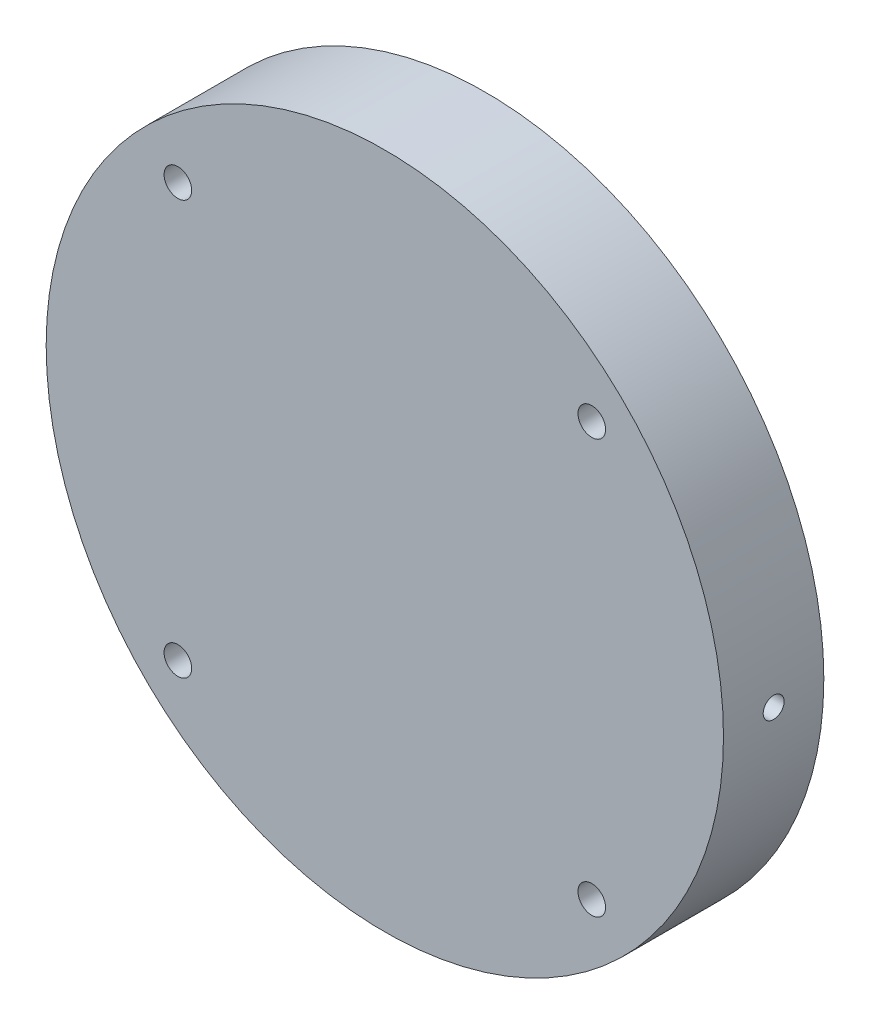
ISO-10303-21;
HEADER;
FILE_DESCRIPTION(('STEP AP214'),'2;1');
FILE_NAME('part.step','',(''),(''),'','','');
FILE_SCHEMA(('AUTOMOTIVE_DESIGN { 1 0 10303 214 1 1 1 1 }'));
ENDSEC;
DATA;
#1=APPLICATION_CONTEXT('core data for automotive mechanical design processes');
#2=APPLICATION_PROTOCOL_DEFINITION('international standard','automotive_design',2000,#1);
#3=PRODUCT_CONTEXT('',#1,'mechanical');
#4=PRODUCT('Part','Part','',(#3));
#5=PRODUCT_RELATED_PRODUCT_CATEGORY('part','',(#4));
#6=PRODUCT_DEFINITION_FORMATION('','',#4);
#7=PRODUCT_DEFINITION_CONTEXT('part definition',#1,'design');
#8=PRODUCT_DEFINITION('design','',#6,#7);
#9=PRODUCT_DEFINITION_SHAPE('','',#8);
#10=(LENGTH_UNIT() NAMED_UNIT(*) SI_UNIT(.MILLI.,.METRE.));
#11=(NAMED_UNIT(*) PLANE_ANGLE_UNIT() SI_UNIT($,.RADIAN.));
#12=(NAMED_UNIT(*) SI_UNIT($,.STERADIAN.) SOLID_ANGLE_UNIT());
#13=UNCERTAINTY_MEASURE_WITH_UNIT(LENGTH_MEASURE(1.E-05),#10,'distance_accuracy_value','');
#14=(GEOMETRIC_REPRESENTATION_CONTEXT(3) GLOBAL_UNCERTAINTY_ASSIGNED_CONTEXT((#13)) GLOBAL_UNIT_ASSIGNED_CONTEXT((#10,
#11,#12)) REPRESENTATION_CONTEXT('',''));
#15=CARTESIAN_POINT('',(0.,0.,0.));
#16=DIRECTION('',(0.,0.,1.));
#17=DIRECTION('',(1.,0.,0.));
#18=AXIS2_PLACEMENT_3D('',#15,#16,#17);
#19=CARTESIAN_POINT('',(0.,0.,12.));
#20=DIRECTION('',(0.,0.,-1.));
#21=DIRECTION('',(-1.,0.,0.));
#22=AXIS2_PLACEMENT_3D('',#19,#20,#21);
#23=CYLINDRICAL_SURFACE('',#22,40.5);
#24=CARTESIAN_POINT('',(40.5,0.,4.75000000000001));
#25=CARTESIAN_POINT('',(40.4999997401698,0.0701951145360593,4.75000310736786));
#26=CARTESIAN_POINT('',(40.4998155477707,0.140440701523904,4.75593267234555));
#27=CARTESIAN_POINT('',(40.4990984748831,0.278996045488437,4.77950391095175));
#28=CARTESIAN_POINT('',(40.4985651780819,0.347303389479052,4.79715956850567));
#29=CARTESIAN_POINT('',(40.4972102897064,0.479954957168128,4.84367879412185));
#30=CARTESIAN_POINT('',(40.4963888393763,0.544301104393843,4.8725368718341));
#31=CARTESIAN_POINT('',(40.4945502970725,0.667217691779053,4.94063386953378));
#32=CARTESIAN_POINT('',(40.493533252822,0.725789535559207,4.9798702581728));
#33=CARTESIAN_POINT('',(40.4914174976183,0.83554065170522,5.06763184249043));
#34=CARTESIAN_POINT('',(40.490318754005,0.886716943316761,5.11616076527566));
#35=CARTESIAN_POINT('',(40.4881637230936,0.980199153577301,5.22112329771871));
#36=CARTESIAN_POINT('',(40.4871074374891,1.02250471865505,5.27755722230622));
#37=CARTESIAN_POINT('',(40.4851562705646,1.09704947867062,5.39673918912488));
#38=CARTESIAN_POINT('',(40.484261418526,1.12928684818432,5.45948837362671));
#39=CARTESIAN_POINT('',(40.4827343342813,1.18276824859674,5.58951150573776));
#40=CARTESIAN_POINT('',(40.4821021009909,1.20401232488276,5.65678543466466));
#41=CARTESIAN_POINT('',(40.4811717855033,1.2348975912265,5.79392555068592));
#42=CARTESIAN_POINT('',(40.4808735961369,1.24454250263951,5.86379089895678));
#43=CARTESIAN_POINT('',(40.4806446684864,1.25196711980756,6.00414962569478));
#44=CARTESIAN_POINT('',(40.4807139286884,1.24974687444769,6.07464300157323));
#45=CARTESIAN_POINT('',(40.4812119900459,1.23350734740564,6.21423148709976));
#46=CARTESIAN_POINT('',(40.4816406686072,1.21949208889029,6.28332706529521));
#47=CARTESIAN_POINT('',(40.482809049167,1.18006660072871,6.41818422832304));
#48=CARTESIAN_POINT('',(40.4835487518711,1.15465634523706,6.48394580559307));
#49=CARTESIAN_POINT('',(40.4852559366052,1.09315755225947,6.6102811737729));
#50=CARTESIAN_POINT('',(40.4862234579563,1.05706717112922,6.67085406666226));
#51=CARTESIAN_POINT('',(40.488277170762,0.975233971561921,6.78508276761878));
#52=CARTESIAN_POINT('',(40.4893633625063,0.929491129555396,6.83873855879517));
#53=CARTESIAN_POINT('',(40.4915325163177,0.829628723808076,6.93763340178835));
#54=CARTESIAN_POINT('',(40.4926154768474,0.775505671470444,6.98286893098563));
#55=CARTESIAN_POINT('',(40.4946556490227,0.660431509347828,7.06361205176098));
#56=CARTESIAN_POINT('',(40.4956128606477,0.599480398440985,7.09911964174074));
#57=CARTESIAN_POINT('',(40.4972936463458,0.472478345778552,7.15939855625796));
#58=CARTESIAN_POINT('',(40.4980172180003,0.40642735123957,7.18416976965723));
#59=CARTESIAN_POINT('',(40.4991491202929,0.271101369502214,7.22227051270385));
#60=CARTESIAN_POINT('',(40.4995574518385,0.201826391585083,7.23560007528741));
#61=CARTESIAN_POINT('',(40.5000127291394,0.0620495237213444,7.25043482031509));
#62=CARTESIAN_POINT('',(40.5000598238567,-0.00845184847957339,7.25194487673143));
#63=CARTESIAN_POINT('',(40.4997877134372,-0.148707100280595,7.24311044626734));
#64=CARTESIAN_POINT('',(40.4994685087506,-0.218460980799522,7.23276597396028));
#65=CARTESIAN_POINT('',(40.4984998696098,-0.355227590857616,7.20052016271211));
#66=CARTESIAN_POINT('',(40.4978504984022,-0.422240842735486,7.17862103714688));
#67=CARTESIAN_POINT('',(40.4962946984923,-0.551639963897454,7.12388980418959));
#68=CARTESIAN_POINT('',(40.4953882692419,-0.614025823314325,7.09105767348535));
#69=CARTESIAN_POINT('',(40.4934200880193,-0.732421678357428,7.01537987027723));
#70=CARTESIAN_POINT('',(40.4923582852174,-0.788429576761468,6.97253091806732));
#71=CARTESIAN_POINT('',(40.490199188575,-0.892458583494792,6.87804061330085));
#72=CARTESIAN_POINT('',(40.4891018946392,-0.940479670406009,6.82639923716659));
#73=CARTESIAN_POINT('',(40.4869950921447,-1.02718818548384,6.71576910949375));
#74=CARTESIAN_POINT('',(40.4859856132424,-1.06587246824192,6.65677789203946));
#75=CARTESIAN_POINT('',(40.4841687227857,-1.13278776142885,6.53313521170553));
#76=CARTESIAN_POINT('',(40.4833613107621,-1.16101879613159,6.46848376197017));
#77=CARTESIAN_POINT('',(40.48203980061,-1.20622070871487,6.33536767135526));
#78=CARTESIAN_POINT('',(40.4815256494901,-1.22319362099849,6.26690372183996));
#79=CARTESIAN_POINT('',(40.4808484820102,-1.24540415885495,6.12809627980892));
#80=CARTESIAN_POINT('',(40.4806854652861,-1.25064179660019,6.05775278924281));
#81=CARTESIAN_POINT('',(40.4807289655028,-1.2492328734932,5.91721453872061));
#82=CARTESIAN_POINT('',(40.4809353282036,-1.24259127299825,5.8470197289337));
#83=CARTESIAN_POINT('',(40.4816939995849,-1.2176226074607,5.7087419764574));
#84=CARTESIAN_POINT('',(40.4822463089505,-1.19929551927702,5.64065903795048));
#85=CARTESIAN_POINT('',(40.4836345878623,-1.15147682252858,5.50853581572959));
#86=CARTESIAN_POINT('',(40.484470562093,-1.12198502958678,5.44449559879863));
#87=CARTESIAN_POINT('',(40.4863318953487,-1.05267572710109,5.32227668770632));
#88=CARTESIAN_POINT('',(40.4873572475588,-1.01285858909954,5.26409778273886));
#89=CARTESIAN_POINT('',(40.4894821855105,-0.924014000321128,5.15523002702427));
#90=CARTESIAN_POINT('',(40.490581794235,-0.874983689545041,5.10454351085483));
#91=CARTESIAN_POINT('',(40.4927313283944,-0.76909528644695,5.01210725955242));
#92=CARTESIAN_POINT('',(40.4937812414624,-0.712235259286227,4.97035973991303));
#93=CARTESIAN_POINT('',(40.4957134097366,-0.592278497600401,4.89697904387425));
#94=CARTESIAN_POINT('',(40.4965955541152,-0.529177681961755,4.86535254405303));
#95=CARTESIAN_POINT('',(40.4980907783657,-0.398607824584967,4.81317937009116));
#96=CARTESIAN_POINT('',(40.4987041788262,-0.331144098338576,4.79261948768989));
#97=CARTESIAN_POINT('',(40.499428913532,-0.219378703445797,4.76860989217457));
#98=CARTESIAN_POINT('',(40.4996421413444,-0.175802433429456,4.76163996794289));
#99=CARTESIAN_POINT('',(40.4999277661545,-0.0881574125274635,4.75233404672987));
#100=CARTESIAN_POINT('',(40.5000001631961,-0.0440886617955865,4.74999804830165));
#101=CARTESIAN_POINT('',(40.5,0.,4.75000000000001));
#102=B_SPLINE_CURVE_WITH_KNOTS('',3,(#24,#25,#26,#27,#28,#29,#30,#31,#32,#33,#34,#35,#36,#37,
#38,#39,#40,#41,#42,#43,#44,#45,#46,#47,#48,#49,#50,#51,#52,#53,#54,#55,#56,#57,#58,#59,#60,#61,
#62,#63,#64,#65,#66,#67,#68,#69,#70,#71,#72,#73,#74,#75,#76,#77,#78,#79,#80,#81,#82,#83,#84,#85,
#86,#87,#88,#89,#90,#91,#92,#93,#94,#95,#96,#97,#98,#99,#100,#101),.UNSPECIFIED.,.T.,.F.,(4,2,2,
2,2,2,2,2,2,2,2,2,2,2,2,2,2,2,2,2,2,2,2,2,2,2,2,2,2,2,2,2,2,2,2,2,2,2,4),(0.,0.210424413908755,
0.421100220650849,0.631672904450732,0.842194275267314,1.05280026082357,1.26341463916158,
1.47406718100888,1.6847188531417,1.89530292394022,2.10588612712154,2.31639753147251,
2.52690941329479,2.73745765570535,2.94800641224042,3.15864305492284,3.36927973221317,
3.57991858986875,3.79055684117212,4.00110822767007,4.21165935532694,4.42217016505525,
4.63268142365375,4.84326170459064,5.05384255022724,5.26449423821536,5.47514543703777,
5.68575855968122,5.89637146386628,6.10689644394822,6.31742184093981,6.52795071475813,
6.73847201405575,6.94905877271395,7.15969766417587,7.37047522365999,7.58100065433494,
7.71316560308385,7.845330510566),.UNSPECIFIED.);
#103=CARTESIAN_POINT('',(40.5,0.,4.75000000000001));
#104=VERTEX_POINT('',#103);
#105=EDGE_CURVE('E10',#104,#104,#102,.T.);
#106=ORIENTED_EDGE('',*,*,#105,.F.);
#107=EDGE_LOOP('',(#106));
#108=FACE_BOUND('',#107,.T.);
#109=CARTESIAN_POINT('',(0.,0.,12.));
#110=DIRECTION('',(0.,0.,-1.));
#111=DIRECTION('',(-1.,0.,0.));
#112=AXIS2_PLACEMENT_3D('',#109,#110,#111);
#113=CIRCLE('',#112,40.5);
#114=CARTESIAN_POINT('',(-40.5,0.,12.));
#115=VERTEX_POINT('',#114);
#116=EDGE_CURVE('E49',#115,#115,#113,.T.);
#117=ORIENTED_EDGE('',*,*,#116,.T.);
#118=EDGE_LOOP('',(#117));
#119=FACE_BOUND('',#118,.T.);
#120=CARTESIAN_POINT('',(0.,0.,0.));
#121=DIRECTION('',(0.,0.,-1.));
#122=DIRECTION('',(-1.,0.,0.));
#123=AXIS2_PLACEMENT_3D('',#120,#121,#122);
#124=CIRCLE('',#123,40.5);
#125=CARTESIAN_POINT('',(-40.5,0.,0.));
#126=VERTEX_POINT('',#125);
#127=EDGE_CURVE('E53',#126,#126,#124,.T.);
#128=ORIENTED_EDGE('',*,*,#127,.F.);
#129=EDGE_LOOP('',(#128));
#130=FACE_BOUND('',#129,.T.);
#131=ADVANCED_FACE('F39',(#108,#119,#130),#23,.T.);
#132=CARTESIAN_POINT('',(40.5,0.,12.));
#133=DIRECTION('',(0.,0.,1.));
#134=DIRECTION('',(1.,0.,0.));
#135=AXIS2_PLACEMENT_3D('',#132,#133,#134);
#136=PLANE('',#135);
#137=CARTESIAN_POINT('',(24.748737341529,24.748737341529,12.));
#138=DIRECTION('',(0.,0.,1.));
#139=DIRECTION('',(1.,0.,0.));
#140=AXIS2_PLACEMENT_3D('',#137,#138,#139);
#141=CIRCLE('',#140,1.64999999999999);
#142=CARTESIAN_POINT('',(26.398737341529,24.748737341529,12.));
#143=VERTEX_POINT('',#142);
#144=EDGE_CURVE('E83',#143,#143,#141,.T.);
#145=ORIENTED_EDGE('',*,*,#144,.F.);
#146=EDGE_LOOP('',(#145));
#147=FACE_BOUND('',#146,.T.);
#148=CARTESIAN_POINT('',(-24.74873734152,24.748737341529,12.));
#149=DIRECTION('',(0.,0.,1.));
#150=DIRECTION('',(1.,0.,0.));
#151=AXIS2_PLACEMENT_3D('',#148,#149,#150);
#152=CIRCLE('',#151,1.64999999999999);
#153=CARTESIAN_POINT('',(-23.09873734152,24.748737341529,12.));
#154=VERTEX_POINT('',#153);
#155=EDGE_CURVE('E76',#154,#154,#152,.T.);
#156=ORIENTED_EDGE('',*,*,#155,.F.);
#157=EDGE_LOOP('',(#156));
#158=FACE_BOUND('',#157,.T.);
#159=CARTESIAN_POINT('',(24.748737341529,-24.74873734152,12.));
#160=DIRECTION('',(0.,0.,1.));
#161=DIRECTION('',(1.,0.,0.));
#162=AXIS2_PLACEMENT_3D('',#159,#160,#161);
#163=CIRCLE('',#162,1.64999999999999);
#164=CARTESIAN_POINT('',(26.398737341529,-24.74873734152,12.));
#165=VERTEX_POINT('',#164);
#166=EDGE_CURVE('E75',#165,#165,#163,.T.);
#167=ORIENTED_EDGE('',*,*,#166,.F.);
#168=EDGE_LOOP('',(#167));
#169=FACE_BOUND('',#168,.T.);
#170=CARTESIAN_POINT('',(-24.74873734152,-24.74873734152,12.));
#171=DIRECTION('',(0.,0.,1.));
#172=DIRECTION('',(1.,0.,0.));
#173=AXIS2_PLACEMENT_3D('',#170,#171,#172);
#174=CIRCLE('',#173,1.64999999999999);
#175=CARTESIAN_POINT('',(-23.09873734152,-24.74873734152,12.));
#176=VERTEX_POINT('',#175);
#177=EDGE_CURVE('E67',#176,#176,#174,.T.);
#178=ORIENTED_EDGE('',*,*,#177,.F.);
#179=EDGE_LOOP('',(#178));
#180=FACE_BOUND('',#179,.T.);
#181=ORIENTED_EDGE('',*,*,#116,.F.);
#182=EDGE_LOOP('',(#181));
#183=FACE_BOUND('',#182,.T.);
#184=ADVANCED_FACE('F88',(#147,#158,#169,#180,#183),#136,.T.);
#185=CARTESIAN_POINT('',(0.,0.,0.));
#186=DIRECTION('',(0.,0.,-1.));
#187=DIRECTION('',(-1.,0.,0.));
#188=AXIS2_PLACEMENT_3D('',#185,#186,#187);
#189=PLANE('',#188);
#190=ORIENTED_EDGE('',*,*,#127,.T.);
#191=EDGE_LOOP('',(#190));
#192=FACE_BOUND('',#191,.T.);
#193=ADVANCED_FACE('F92',(#192),#189,.T.);
#194=CARTESIAN_POINT('',(30.5,0.,6.));
#195=DIRECTION('',(-1.,0.,0.));
#196=DIRECTION('',(0.,0.,1.));
#197=AXIS2_PLACEMENT_3D('',#194,#195,#196);
#198=PLANE('',#197);
#199=CARTESIAN_POINT('',(30.5,0.,6.));
#200=DIRECTION('',(1.,0.,0.));
#201=DIRECTION('',(0.,0.,-1.));
#202=AXIS2_PLACEMENT_3D('',#199,#200,#201);
#203=CIRCLE('',#202,1.24999999999999);
#204=CARTESIAN_POINT('',(30.5,0.,4.75000000000001));
#205=VERTEX_POINT('',#204);
#206=EDGE_CURVE('E59',#205,#205,#203,.T.);
#207=ORIENTED_EDGE('',*,*,#206,.T.);
#208=EDGE_LOOP('',(#207));
#209=FACE_BOUND('',#208,.T.);
#210=ADVANCED_FACE('F130',(#209),#198,.F.);
#211=CARTESIAN_POINT('',(40.5,0.,6.));
#212=DIRECTION('',(1.,0.,0.));
#213=DIRECTION('',(0.,0.,-1.));
#214=AXIS2_PLACEMENT_3D('',#211,#212,#213);
#215=CYLINDRICAL_SURFACE('',#214,1.24999999999999);
#216=ORIENTED_EDGE('',*,*,#105,.T.);
#217=EDGE_LOOP('',(#216));
#218=FACE_BOUND('',#217,.T.);
#219=ORIENTED_EDGE('',*,*,#206,.F.);
#220=EDGE_LOOP('',(#219));
#221=FACE_BOUND('',#220,.T.);
#222=ADVANCED_FACE('F112',(#218,#221),#215,.F.);
#223=CARTESIAN_POINT('',(-24.74873734152,-24.74873734152,4.));
#224=DIRECTION('',(0.,0.,-1.));
#225=DIRECTION('',(-1.,0.,0.));
#226=AXIS2_PLACEMENT_3D('',#223,#224,#225);
#227=PLANE('',#226);
#228=CARTESIAN_POINT('',(-24.74873734152,-24.74873734152,4.));
#229=DIRECTION('',(0.,0.,1.));
#230=DIRECTION('',(1.,0.,0.));
#231=AXIS2_PLACEMENT_3D('',#228,#229,#230);
#232=CIRCLE('',#231,1.64999999999998);
#233=CARTESIAN_POINT('',(-23.09873734152,-24.74873734152,4.));
#234=VERTEX_POINT('',#233);
#235=EDGE_CURVE('E62',#234,#234,#232,.T.);
#236=ORIENTED_EDGE('',*,*,#235,.T.);
#237=EDGE_LOOP('',(#236));
#238=FACE_BOUND('',#237,.T.);
#239=ADVANCED_FACE('F104',(#238),#227,.F.);
#240=CARTESIAN_POINT('',(-24.74873734152,-24.74873734152,12.));
#241=DIRECTION('',(0.,0.,1.));
#242=DIRECTION('',(1.,0.,0.));
#243=AXIS2_PLACEMENT_3D('',#240,#241,#242);
#244=CYLINDRICAL_SURFACE('',#243,1.64999999999999);
#245=ORIENTED_EDGE('',*,*,#235,.F.);
#246=EDGE_LOOP('',(#245));
#247=FACE_BOUND('',#246,.T.);
#248=ORIENTED_EDGE('',*,*,#177,.T.);
#249=EDGE_LOOP('',(#248));
#250=FACE_BOUND('',#249,.T.);
#251=ADVANCED_FACE('F103',(#247,#250),#244,.F.);
#252=CARTESIAN_POINT('',(24.748737341529,-24.74873734152,4.));
#253=DIRECTION('',(0.,0.,-1.));
#254=DIRECTION('',(-1.,0.,0.));
#255=AXIS2_PLACEMENT_3D('',#252,#253,#254);
#256=PLANE('',#255);
#257=CARTESIAN_POINT('',(24.748737341529,-24.74873734152,4.));
#258=DIRECTION('',(0.,0.,1.));
#259=DIRECTION('',(1.,0.,0.));
#260=AXIS2_PLACEMENT_3D('',#257,#258,#259);
#261=CIRCLE('',#260,1.64999999999998);
#262=CARTESIAN_POINT('',(26.398737341529,-24.74873734152,4.));
#263=VERTEX_POINT('',#262);
#264=EDGE_CURVE('E66',#263,#263,#261,.T.);
#265=ORIENTED_EDGE('',*,*,#264,.T.);
#266=EDGE_LOOP('',(#265));
#267=FACE_BOUND('',#266,.T.);
#268=ADVANCED_FACE('F101',(#267),#256,.F.);
#269=CARTESIAN_POINT('',(24.748737341529,-24.74873734152,12.));
#270=DIRECTION('',(0.,0.,1.));
#271=DIRECTION('',(1.,0.,0.));
#272=AXIS2_PLACEMENT_3D('',#269,#270,#271);
#273=CYLINDRICAL_SURFACE('',#272,1.64999999999999);
#274=ORIENTED_EDGE('',*,*,#264,.F.);
#275=EDGE_LOOP('',(#274));
#276=FACE_BOUND('',#275,.T.);
#277=ORIENTED_EDGE('',*,*,#166,.T.);
#278=EDGE_LOOP('',(#277));
#279=FACE_BOUND('',#278,.T.);
#280=ADVANCED_FACE('F111',(#276,#279),#273,.F.);
#281=CARTESIAN_POINT('',(-24.74873734152,24.748737341529,4.));
#282=DIRECTION('',(0.,0.,-1.));
#283=DIRECTION('',(-1.,0.,0.));
#284=AXIS2_PLACEMENT_3D('',#281,#282,#283);
#285=PLANE('',#284);
#286=CARTESIAN_POINT('',(-24.74873734152,24.748737341529,4.));
#287=DIRECTION('',(0.,0.,1.));
#288=DIRECTION('',(1.,0.,0.));
#289=AXIS2_PLACEMENT_3D('',#286,#287,#288);
#290=CIRCLE('',#289,1.64999999999998);
#291=CARTESIAN_POINT('',(-23.09873734152,24.748737341529,4.));
#292=VERTEX_POINT('',#291);
#293=EDGE_CURVE('E74',#292,#292,#290,.T.);
#294=ORIENTED_EDGE('',*,*,#293,.T.);
#295=EDGE_LOOP('',(#294));
#296=FACE_BOUND('',#295,.T.);
#297=ADVANCED_FACE('F171',(#296),#285,.F.);
#298=CARTESIAN_POINT('',(-24.74873734152,24.748737341529,12.));
#299=DIRECTION('',(0.,0.,1.));
#300=DIRECTION('',(1.,0.,0.));
#301=AXIS2_PLACEMENT_3D('',#298,#299,#300);
#302=CYLINDRICAL_SURFACE('',#301,1.64999999999999);
#303=ORIENTED_EDGE('',*,*,#293,.F.);
#304=EDGE_LOOP('',(#303));
#305=FACE_BOUND('',#304,.T.);
#306=ORIENTED_EDGE('',*,*,#155,.T.);
#307=EDGE_LOOP('',(#306));
#308=FACE_BOUND('',#307,.T.);
#309=ADVANCED_FACE('F181',(#305,#308),#302,.F.);
#310=CARTESIAN_POINT('',(24.748737341529,24.748737341529,4.));
#311=DIRECTION('',(0.,0.,-1.));
#312=DIRECTION('',(-1.,0.,0.));
#313=AXIS2_PLACEMENT_3D('',#310,#311,#312);
#314=PLANE('',#313);
#315=CARTESIAN_POINT('',(24.748737341529,24.748737341529,4.));
#316=DIRECTION('',(0.,0.,1.));
#317=DIRECTION('',(1.,0.,0.));
#318=AXIS2_PLACEMENT_3D('',#315,#316,#317);
#319=CIRCLE('',#318,1.64999999999998);
#320=CARTESIAN_POINT('',(26.398737341529,24.748737341529,4.));
#321=VERTEX_POINT('',#320);
#322=EDGE_CURVE('E81',#321,#321,#319,.T.);
#323=ORIENTED_EDGE('',*,*,#322,.T.);
#324=EDGE_LOOP('',(#323));
#325=FACE_BOUND('',#324,.T.);
#326=ADVANCED_FACE('F191',(#325),#314,.F.);
#327=CARTESIAN_POINT('',(24.748737341529,24.748737341529,12.));
#328=DIRECTION('',(0.,0.,1.));
#329=DIRECTION('',(1.,0.,0.));
#330=AXIS2_PLACEMENT_3D('',#327,#328,#329);
#331=CYLINDRICAL_SURFACE('',#330,1.64999999999999);
#332=ORIENTED_EDGE('',*,*,#322,.F.);
#333=EDGE_LOOP('',(#332));
#334=FACE_BOUND('',#333,.T.);
#335=ORIENTED_EDGE('',*,*,#144,.T.);
#336=EDGE_LOOP('',(#335));
#337=FACE_BOUND('',#336,.T.);
#338=ADVANCED_FACE('F90',(#334,#337),#331,.F.);
#339=CLOSED_SHELL('',(#131,#184,#193,#210,#222,#239,#251,#268,#280,#297,#309,#326,#338));
#340=MANIFOLD_SOLID_BREP('B2',#339);
#341=ADVANCED_BREP_SHAPE_REPRESENTATION('',(#18,#340),#14);
#342=SHAPE_DEFINITION_REPRESENTATION(#9,#341);
ENDSEC;
END-ISO-10303-21;
